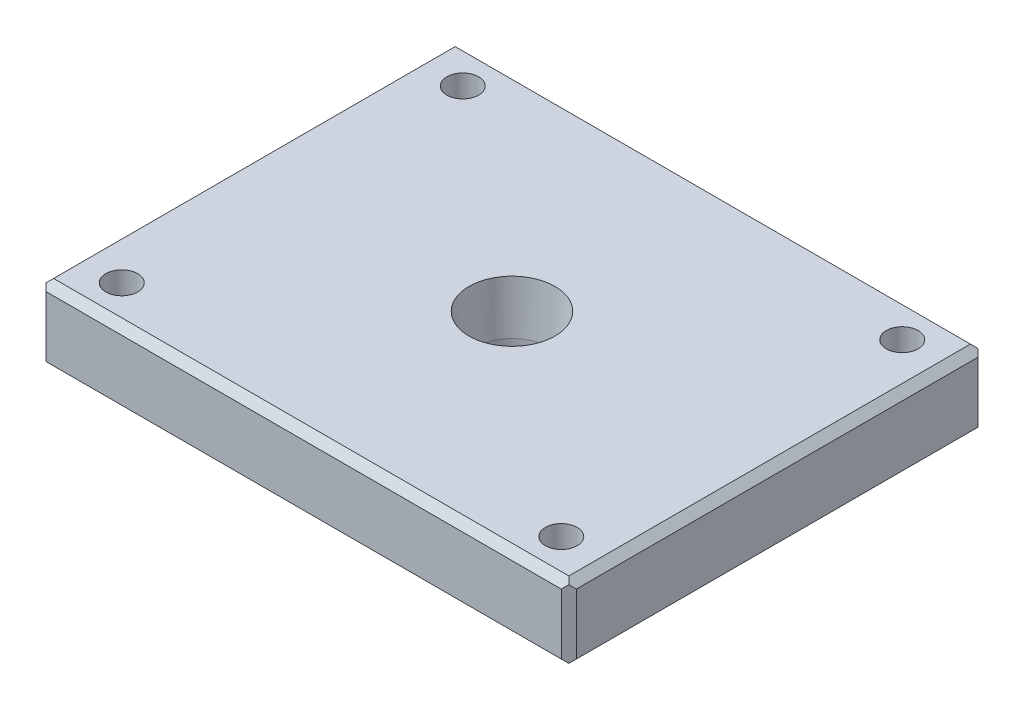
ISO-10303-21;
HEADER;
FILE_DESCRIPTION(('STEP AP214'),'2;1');
FILE_NAME('part.step','',(''),(''),'','','');
FILE_SCHEMA(('AUTOMOTIVE_DESIGN { 1 0 10303 214 1 1 1 1 }'));
ENDSEC;
DATA;
#1=APPLICATION_CONTEXT('core data for automotive mechanical design processes');
#2=APPLICATION_PROTOCOL_DEFINITION('international standard','automotive_design',2000,#1);
#3=PRODUCT_CONTEXT('',#1,'mechanical');
#4=PRODUCT('Part','Part','',(#3));
#5=PRODUCT_RELATED_PRODUCT_CATEGORY('part','',(#4));
#6=PRODUCT_DEFINITION_FORMATION('','',#4);
#7=PRODUCT_DEFINITION_CONTEXT('part definition',#1,'design');
#8=PRODUCT_DEFINITION('design','',#6,#7);
#9=PRODUCT_DEFINITION_SHAPE('','',#8);
#10=(LENGTH_UNIT() NAMED_UNIT(*) SI_UNIT(.MILLI.,.METRE.));
#11=(NAMED_UNIT(*) PLANE_ANGLE_UNIT() SI_UNIT($,.RADIAN.));
#12=(NAMED_UNIT(*) SI_UNIT($,.STERADIAN.) SOLID_ANGLE_UNIT());
#13=UNCERTAINTY_MEASURE_WITH_UNIT(LENGTH_MEASURE(1.E-05),#10,'distance_accuracy_value','');
#14=(GEOMETRIC_REPRESENTATION_CONTEXT(3) GLOBAL_UNCERTAINTY_ASSIGNED_CONTEXT((#13)) GLOBAL_UNIT_ASSIGNED_CONTEXT((#10,
#11,#12)) REPRESENTATION_CONTEXT('',''));
#15=CARTESIAN_POINT('',(0.,0.,0.));
#16=DIRECTION('',(0.,0.,1.));
#17=DIRECTION('',(1.,0.,0.));
#18=AXIS2_PLACEMENT_3D('',#15,#16,#17);
#19=CARTESIAN_POINT('',(0.,-10.,0.));
#20=DIRECTION('',(0.,1.,0.));
#21=DIRECTION('',(0.,0.,1.));
#22=AXIS2_PLACEMENT_3D('',#19,#20,#21);
#23=CYLINDRICAL_SURFACE('',#22,5.2);
#24=CARTESIAN_POINT('',(0.,-10.,0.));
#25=DIRECTION('',(0.,1.,0.));
#26=DIRECTION('',(0.,0.,1.));
#27=AXIS2_PLACEMENT_3D('',#24,#25,#26);
#28=CIRCLE('',#27,5.2);
#29=CARTESIAN_POINT('',(0.,-10.,5.2));
#30=VERTEX_POINT('',#29);
#31=EDGE_CURVE('E262',#30,#30,#28,.T.);
#32=ORIENTED_EDGE('',*,*,#31,.F.);
#33=EDGE_LOOP('',(#32));
#34=FACE_BOUND('',#33,.T.);
#35=CARTESIAN_POINT('',(0.,-6.8,0.));
#36=DIRECTION('',(0.,1.,0.));
#37=DIRECTION('',(0.,0.,-1.));
#38=AXIS2_PLACEMENT_3D('',#35,#36,#37);
#39=CIRCLE('',#38,5.2);
#40=CARTESIAN_POINT('',(0.,-6.8,-5.2));
#41=VERTEX_POINT('',#40);
#42=EDGE_CURVE('E12',#41,#41,#39,.T.);
#43=ORIENTED_EDGE('',*,*,#42,.T.);
#44=EDGE_LOOP('',(#43));
#45=FACE_BOUND('',#44,.T.);
#46=ADVANCED_FACE('F56',(#34,#45),#23,.F.);
#47=CARTESIAN_POINT('',(35.,-10.,27.5));
#48=DIRECTION('',(1.,0.,0.));
#49=DIRECTION('',(0.,0.,-1.));
#50=AXIS2_PLACEMENT_3D('',#47,#48,#49);
#51=PLANE('',#50);
#52=DIRECTION('',(0.,0.,-1.));
#53=VECTOR('',#52,1.);
#54=CARTESIAN_POINT('',(35.,-9.,27.5));
#55=LINE('',#54,#53);
#56=CARTESIAN_POINT('',(35.,-9.,26.5));
#57=VERTEX_POINT('',#56);
#58=CARTESIAN_POINT('',(35.,-9.,-26.5));
#59=VERTEX_POINT('',#58);
#60=EDGE_CURVE('E230',#57,#59,#55,.T.);
#61=ORIENTED_EDGE('',*,*,#60,.T.);
#62=DIRECTION('',(0.,1.,0.));
#63=VECTOR('',#62,1.);
#64=CARTESIAN_POINT('',(35.,-10.,-26.5));
#65=LINE('',#64,#63);
#66=CARTESIAN_POINT('',(35.,-1.00000000000003,-26.5));
#67=VERTEX_POINT('',#66);
#68=EDGE_CURVE('E310',#59,#67,#65,.T.);
#69=ORIENTED_EDGE('',*,*,#68,.T.);
#70=DIRECTION('',(0.,0.,1.));
#71=VECTOR('',#70,1.);
#72=CARTESIAN_POINT('',(35.,-1.00000000000003,27.5));
#73=LINE('',#72,#71);
#74=CARTESIAN_POINT('',(35.,-1.00000000000003,26.5));
#75=VERTEX_POINT('',#74);
#76=EDGE_CURVE('E226',#67,#75,#73,.T.);
#77=ORIENTED_EDGE('',*,*,#76,.T.);
#78=DIRECTION('',(0.,-1.,0.));
#79=VECTOR('',#78,1.);
#80=CARTESIAN_POINT('',(35.,-10.,26.5));
#81=LINE('',#80,#79);
#82=EDGE_CURVE('E307',#75,#57,#81,.T.);
#83=ORIENTED_EDGE('',*,*,#82,.T.);
#84=EDGE_LOOP('',(#61,#69,#77,#83));
#85=FACE_BOUND('',#84,.T.);
#86=ADVANCED_FACE('F367',(#85),#51,.T.);
#87=CARTESIAN_POINT('',(-35.,-10.,27.5));
#88=DIRECTION('',(0.,0.,1.));
#89=DIRECTION('',(1.,0.,0.));
#90=AXIS2_PLACEMENT_3D('',#87,#88,#89);
#91=PLANE('',#90);
#92=DIRECTION('',(1.,0.,0.));
#93=VECTOR('',#92,1.);
#94=CARTESIAN_POINT('',(-35.,-9.,27.5));
#95=LINE('',#94,#93);
#96=CARTESIAN_POINT('',(-34.,-9.,27.5));
#97=VERTEX_POINT('',#96);
#98=CARTESIAN_POINT('',(34.,-9.,27.5));
#99=VERTEX_POINT('',#98);
#100=EDGE_CURVE('E222',#97,#99,#95,.T.);
#101=ORIENTED_EDGE('',*,*,#100,.T.);
#102=DIRECTION('',(0.,1.,0.));
#103=VECTOR('',#102,1.);
#104=CARTESIAN_POINT('',(34.,-10.,27.5));
#105=LINE('',#104,#103);
#106=CARTESIAN_POINT('',(34.,-1.00000000000003,27.5));
#107=VERTEX_POINT('',#106);
#108=EDGE_CURVE('E329',#99,#107,#105,.T.);
#109=ORIENTED_EDGE('',*,*,#108,.T.);
#110=DIRECTION('',(-1.,0.,0.));
#111=VECTOR('',#110,1.);
#112=CARTESIAN_POINT('',(-35.,-1.00000000000003,27.5));
#113=LINE('',#112,#111);
#114=CARTESIAN_POINT('',(-34.,-1.00000000000003,27.5));
#115=VERTEX_POINT('',#114);
#116=EDGE_CURVE('E219',#107,#115,#113,.T.);
#117=ORIENTED_EDGE('',*,*,#116,.T.);
#118=DIRECTION('',(0.,-1.,0.));
#119=VECTOR('',#118,1.);
#120=CARTESIAN_POINT('',(-34.,-10.,27.5));
#121=LINE('',#120,#119);
#122=EDGE_CURVE('E326',#115,#97,#121,.T.);
#123=ORIENTED_EDGE('',*,*,#122,.T.);
#124=EDGE_LOOP('',(#101,#109,#117,#123));
#125=FACE_BOUND('',#124,.T.);
#126=ADVANCED_FACE('F348',(#125),#91,.T.);
#127=CARTESIAN_POINT('',(-35.,-10.,27.5));
#128=DIRECTION('',(-1.,0.,0.));
#129=DIRECTION('',(0.,0.,1.));
#130=AXIS2_PLACEMENT_3D('',#127,#128,#129);
#131=PLANE('',#130);
#132=DIRECTION('',(0.,0.,-1.));
#133=VECTOR('',#132,1.);
#134=CARTESIAN_POINT('',(-35.,-1.00000000000003,-27.5));
#135=LINE('',#134,#133);
#136=CARTESIAN_POINT('',(-35.,-1.00000000000003,26.5));
#137=VERTEX_POINT('',#136);
#138=CARTESIAN_POINT('',(-35.,-1.00000000000003,-26.5));
#139=VERTEX_POINT('',#138);
#140=EDGE_CURVE('E205',#137,#139,#135,.T.);
#141=ORIENTED_EDGE('',*,*,#140,.T.);
#142=DIRECTION('',(0.,-1.,0.));
#143=VECTOR('',#142,1.);
#144=CARTESIAN_POINT('',(-35.,-10.,-26.5));
#145=LINE('',#144,#143);
#146=CARTESIAN_POINT('',(-35.,-9.,-26.5));
#147=VERTEX_POINT('',#146);
#148=EDGE_CURVE('E293',#139,#147,#145,.T.);
#149=ORIENTED_EDGE('',*,*,#148,.T.);
#150=DIRECTION('',(0.,0.,1.));
#151=VECTOR('',#150,1.);
#152=CARTESIAN_POINT('',(-35.,-9.,27.5));
#153=LINE('',#152,#151);
#154=CARTESIAN_POINT('',(-35.,-9.,26.5));
#155=VERTEX_POINT('',#154);
#156=EDGE_CURVE('E211',#147,#155,#153,.T.);
#157=ORIENTED_EDGE('',*,*,#156,.T.);
#158=DIRECTION('',(0.,1.,0.));
#159=VECTOR('',#158,1.);
#160=CARTESIAN_POINT('',(-35.,-10.,26.5));
#161=LINE('',#160,#159);
#162=EDGE_CURVE('E289',#155,#137,#161,.T.);
#163=ORIENTED_EDGE('',*,*,#162,.T.);
#164=EDGE_LOOP('',(#141,#149,#157,#163));
#165=FACE_BOUND('',#164,.T.);
#166=ADVANCED_FACE('F391',(#165),#131,.T.);
#167=CARTESIAN_POINT('',(-35.,-10.,-27.5));
#168=DIRECTION('',(0.,0.,-1.));
#169=DIRECTION('',(-1.,0.,0.));
#170=AXIS2_PLACEMENT_3D('',#167,#168,#169);
#171=PLANE('',#170);
#172=DIRECTION('',(-1.,0.,0.));
#173=VECTOR('',#172,1.);
#174=CARTESIAN_POINT('',(-35.,-9.,-27.5));
#175=LINE('',#174,#173);
#176=CARTESIAN_POINT('',(34.,-9.,-27.5));
#177=VERTEX_POINT('',#176);
#178=CARTESIAN_POINT('',(-34.,-9.,-27.5));
#179=VERTEX_POINT('',#178);
#180=EDGE_CURVE('E199',#177,#179,#175,.T.);
#181=ORIENTED_EDGE('',*,*,#180,.T.);
#182=DIRECTION('',(0.,1.,0.));
#183=VECTOR('',#182,1.);
#184=CARTESIAN_POINT('',(-34.,-10.,-27.5));
#185=LINE('',#184,#183);
#186=CARTESIAN_POINT('',(-34.,-1.00000000000003,-27.5));
#187=VERTEX_POINT('',#186);
#188=EDGE_CURVE('E273',#179,#187,#185,.T.);
#189=ORIENTED_EDGE('',*,*,#188,.T.);
#190=DIRECTION('',(1.,0.,0.));
#191=VECTOR('',#190,1.);
#192=CARTESIAN_POINT('',(35.,-1.00000000000003,-27.5));
#193=LINE('',#192,#191);
#194=CARTESIAN_POINT('',(34.,-1.00000000000003,-27.5));
#195=VERTEX_POINT('',#194);
#196=EDGE_CURVE('E257',#187,#195,#193,.T.);
#197=ORIENTED_EDGE('',*,*,#196,.T.);
#198=DIRECTION('',(0.,-1.,0.));
#199=VECTOR('',#198,1.);
#200=CARTESIAN_POINT('',(34.,-10.,-27.5));
#201=LINE('',#200,#199);
#202=EDGE_CURVE('E248',#195,#177,#201,.T.);
#203=ORIENTED_EDGE('',*,*,#202,.T.);
#204=EDGE_LOOP('',(#181,#189,#197,#203));
#205=FACE_BOUND('',#204,.T.);
#206=ADVANCED_FACE('F385',(#205),#171,.T.);
#207=CARTESIAN_POINT('',(0.,-10.,0.));
#208=DIRECTION('',(0.,-1.,0.));
#209=DIRECTION('',(0.,0.,-1.));
#210=AXIS2_PLACEMENT_3D('',#207,#208,#209);
#211=PLANE('',#210);
#212=CARTESIAN_POINT('',(-29.,-10.,-22.5));
#213=DIRECTION('',(0.,1.,0.));
#214=DIRECTION('',(0.,0.,1.));
#215=AXIS2_PLACEMENT_3D('',#212,#213,#214);
#216=CIRCLE('',#215,2.1);
#217=CARTESIAN_POINT('',(-29.,-10.,-20.4));
#218=VERTEX_POINT('',#217);
#219=EDGE_CURVE('E525',#218,#218,#216,.T.);
#220=ORIENTED_EDGE('',*,*,#219,.T.);
#221=EDGE_LOOP('',(#220));
#222=FACE_BOUND('',#221,.T.);
#223=CARTESIAN_POINT('',(29.,-10.,-22.5));
#224=DIRECTION('',(0.,1.,0.));
#225=DIRECTION('',(0.,0.,1.));
#226=AXIS2_PLACEMENT_3D('',#223,#224,#225);
#227=CIRCLE('',#226,2.1);
#228=CARTESIAN_POINT('',(29.,-10.,-20.4));
#229=VERTEX_POINT('',#228);
#230=EDGE_CURVE('E517',#229,#229,#227,.T.);
#231=ORIENTED_EDGE('',*,*,#230,.T.);
#232=EDGE_LOOP('',(#231));
#233=FACE_BOUND('',#232,.T.);
#234=CARTESIAN_POINT('',(29.,-10.,22.5));
#235=DIRECTION('',(0.,1.,0.));
#236=DIRECTION('',(0.,0.,1.));
#237=AXIS2_PLACEMENT_3D('',#234,#235,#236);
#238=CIRCLE('',#237,2.1);
#239=CARTESIAN_POINT('',(29.,-10.,24.6));
#240=VERTEX_POINT('',#239);
#241=EDGE_CURVE('E509',#240,#240,#238,.T.);
#242=ORIENTED_EDGE('',*,*,#241,.T.);
#243=EDGE_LOOP('',(#242));
#244=FACE_BOUND('',#243,.T.);
#245=CARTESIAN_POINT('',(-29.,-10.,22.5));
#246=DIRECTION('',(0.,1.,0.));
#247=DIRECTION('',(0.,0.,1.));
#248=AXIS2_PLACEMENT_3D('',#245,#246,#247);
#249=CIRCLE('',#248,2.1);
#250=CARTESIAN_POINT('',(-29.,-10.,24.6));
#251=VERTEX_POINT('',#250);
#252=EDGE_CURVE('E501',#251,#251,#249,.T.);
#253=ORIENTED_EDGE('',*,*,#252,.T.);
#254=EDGE_LOOP('',(#253));
#255=FACE_BOUND('',#254,.T.);
#256=ORIENTED_EDGE('',*,*,#31,.T.);
#257=EDGE_LOOP('',(#256));
#258=FACE_BOUND('',#257,.T.);
#259=DIRECTION('',(0.,0.,-1.));
#260=VECTOR('',#259,1.);
#261=CARTESIAN_POINT('',(-34.,-10.,0.));
#262=LINE('',#261,#260);
#263=CARTESIAN_POINT('',(-34.,-10.,26.5));
#264=VERTEX_POINT('',#263);
#265=CARTESIAN_POINT('',(-34.,-10.,-26.5));
#266=VERTEX_POINT('',#265);
#267=EDGE_CURVE('E203',#264,#266,#262,.T.);
#268=ORIENTED_EDGE('',*,*,#267,.T.);
#269=DIRECTION('',(1.,0.,0.));
#270=VECTOR('',#269,1.);
#271=CARTESIAN_POINT('',(0.,-10.,-26.5));
#272=LINE('',#271,#270);
#273=CARTESIAN_POINT('',(34.,-10.,-26.5));
#274=VERTEX_POINT('',#273);
#275=EDGE_CURVE('E179',#266,#274,#272,.T.);
#276=ORIENTED_EDGE('',*,*,#275,.T.);
#277=DIRECTION('',(0.,0.,1.));
#278=VECTOR('',#277,1.);
#279=CARTESIAN_POINT('',(34.,-10.,0.));
#280=LINE('',#279,#278);
#281=CARTESIAN_POINT('',(34.,-10.,26.5));
#282=VERTEX_POINT('',#281);
#283=EDGE_CURVE('E191',#274,#282,#280,.T.);
#284=ORIENTED_EDGE('',*,*,#283,.T.);
#285=DIRECTION('',(-1.,0.,0.));
#286=VECTOR('',#285,1.);
#287=CARTESIAN_POINT('',(0.,-10.,26.5));
#288=LINE('',#287,#286);
#289=EDGE_CURVE('E198',#282,#264,#288,.T.);
#290=ORIENTED_EDGE('',*,*,#289,.T.);
#291=EDGE_LOOP('',(#268,#276,#284,#290));
#292=FACE_BOUND('',#291,.T.);
#293=ADVANCED_FACE('F201',(#222,#233,#244,#255,#258,#292),#211,.T.);
#294=CARTESIAN_POINT('',(0.,0.,0.));
#295=DIRECTION('',(0.,-1.,0.));
#296=DIRECTION('',(0.,0.,-1.));
#297=AXIS2_PLACEMENT_3D('',#294,#295,#296);
#298=PLANE('',#297);
#299=CARTESIAN_POINT('',(-29.,0.,-22.5));
#300=DIRECTION('',(0.,1.,0.));
#301=DIRECTION('',(0.,0.,1.));
#302=AXIS2_PLACEMENT_3D('',#299,#300,#301);
#303=CIRCLE('',#302,2.1);
#304=CARTESIAN_POINT('',(-29.,0.,-20.4));
#305=VERTEX_POINT('',#304);
#306=EDGE_CURVE('E529',#305,#305,#303,.T.);
#307=ORIENTED_EDGE('',*,*,#306,.F.);
#308=EDGE_LOOP('',(#307));
#309=FACE_BOUND('',#308,.T.);
#310=CARTESIAN_POINT('',(29.,0.,-22.5));
#311=DIRECTION('',(0.,1.,0.));
#312=DIRECTION('',(0.,0.,1.));
#313=AXIS2_PLACEMENT_3D('',#310,#311,#312);
#314=CIRCLE('',#313,2.1);
#315=CARTESIAN_POINT('',(29.,0.,-20.4));
#316=VERTEX_POINT('',#315);
#317=EDGE_CURVE('E521',#316,#316,#314,.T.);
#318=ORIENTED_EDGE('',*,*,#317,.F.);
#319=EDGE_LOOP('',(#318));
#320=FACE_BOUND('',#319,.T.);
#321=CARTESIAN_POINT('',(29.,0.,22.5));
#322=DIRECTION('',(0.,1.,0.));
#323=DIRECTION('',(0.,0.,1.));
#324=AXIS2_PLACEMENT_3D('',#321,#322,#323);
#325=CIRCLE('',#324,2.1);
#326=CARTESIAN_POINT('',(29.,0.,24.6));
#327=VERTEX_POINT('',#326);
#328=EDGE_CURVE('E513',#327,#327,#325,.T.);
#329=ORIENTED_EDGE('',*,*,#328,.F.);
#330=EDGE_LOOP('',(#329));
#331=FACE_BOUND('',#330,.T.);
#332=CARTESIAN_POINT('',(-29.,0.,22.5));
#333=DIRECTION('',(0.,1.,0.));
#334=DIRECTION('',(0.,0.,1.));
#335=AXIS2_PLACEMENT_3D('',#332,#333,#334);
#336=CIRCLE('',#335,2.1);
#337=CARTESIAN_POINT('',(-29.,0.,24.6));
#338=VERTEX_POINT('',#337);
#339=EDGE_CURVE('E505',#338,#338,#336,.T.);
#340=ORIENTED_EDGE('',*,*,#339,.F.);
#341=EDGE_LOOP('',(#340));
#342=FACE_BOUND('',#341,.T.);
#343=CARTESIAN_POINT('',(0.,0.,0.));
#344=DIRECTION('',(0.,-1.,0.));
#345=DIRECTION('',(0.,0.,-1.));
#346=AXIS2_PLACEMENT_3D('',#343,#344,#345);
#347=CIRCLE('',#346,5.67550232121587);
#348=CARTESIAN_POINT('',(0.,0.,-5.67550232121587));
#349=VERTEX_POINT('',#348);
#350=EDGE_CURVE('E60',#349,#349,#347,.F.);
#351=ORIENTED_EDGE('',*,*,#350,.F.);
#352=EDGE_LOOP('',(#351));
#353=FACE_BOUND('',#352,.T.);
#354=DIRECTION('',(0.,0.,1.));
#355=VECTOR('',#354,1.);
#356=CARTESIAN_POINT('',(-34.,0.,27.5));
#357=LINE('',#356,#355);
#358=CARTESIAN_POINT('',(-34.,0.,-26.5));
#359=VERTEX_POINT('',#358);
#360=CARTESIAN_POINT('',(-34.,0.,26.5));
#361=VERTEX_POINT('',#360);
#362=EDGE_CURVE('E241',#359,#361,#357,.T.);
#363=ORIENTED_EDGE('',*,*,#362,.T.);
#364=DIRECTION('',(1.,0.,0.));
#365=VECTOR('',#364,1.);
#366=CARTESIAN_POINT('',(35.,0.,26.5));
#367=LINE('',#366,#365);
#368=CARTESIAN_POINT('',(34.,0.,26.5));
#369=VERTEX_POINT('',#368);
#370=EDGE_CURVE('E244',#361,#369,#367,.T.);
#371=ORIENTED_EDGE('',*,*,#370,.T.);
#372=DIRECTION('',(0.,0.,-1.));
#373=VECTOR('',#372,1.);
#374=CARTESIAN_POINT('',(34.,0.,-27.5));
#375=LINE('',#374,#373);
#376=CARTESIAN_POINT('',(34.,0.,-26.5));
#377=VERTEX_POINT('',#376);
#378=EDGE_CURVE('E234',#369,#377,#375,.T.);
#379=ORIENTED_EDGE('',*,*,#378,.T.);
#380=DIRECTION('',(-1.,0.,0.));
#381=VECTOR('',#380,1.);
#382=CARTESIAN_POINT('',(-35.,0.,-26.5));
#383=LINE('',#382,#381);
#384=EDGE_CURVE('E238',#377,#359,#383,.T.);
#385=ORIENTED_EDGE('',*,*,#384,.T.);
#386=EDGE_LOOP('',(#363,#371,#379,#385));
#387=FACE_BOUND('',#386,.T.);
#388=ADVANCED_FACE('F384',(#309,#320,#331,#342,#353,#387),#298,.F.);
#389=CARTESIAN_POINT('',(-35.,-9.,27.5));
#390=DIRECTION('',(0.,0.707106781186547,-0.707106781186547));
#391=DIRECTION('',(1.,0.,0.));
#392=AXIS2_PLACEMENT_3D('',#389,#390,#391);
#393=PLANE('',#392);
#394=DIRECTION('',(-0.577350269189626,-0.577350269189626,-0.577350269189626));
#395=VECTOR('',#394,1.);
#396=CARTESIAN_POINT('',(35.,-9.,27.5));
#397=LINE('',#396,#395);
#398=CARTESIAN_POINT('',(34.5,-9.50000000000001,27.));
#399=VERTEX_POINT('',#398);
#400=EDGE_CURVE('E194',#399,#282,#397,.T.);
#401=ORIENTED_EDGE('',*,*,#400,.F.);
#402=DIRECTION('',(-0.57735026918962,0.577350269189628,0.577350269189628));
#403=VECTOR('',#402,1.);
#404=CARTESIAN_POINT('',(11.0000000000004,13.9999999999999,50.4999999999999));
#405=LINE('',#404,#403);
#406=EDGE_CURVE('E66',#399,#99,#405,.T.);
#407=ORIENTED_EDGE('',*,*,#406,.T.);
#408=ORIENTED_EDGE('',*,*,#100,.F.);
#409=DIRECTION('',(-0.577350269189626,-0.577350269189626,-0.577350269189626));
#410=VECTOR('',#409,1.);
#411=CARTESIAN_POINT('',(-34.3333333333333,-9.33333333333333,27.1666666666667));
#412=LINE('',#411,#410);
#413=CARTESIAN_POINT('',(-34.5,-9.5,27.));
#414=VERTEX_POINT('',#413);
#415=EDGE_CURVE('E336',#97,#414,#412,.T.);
#416=ORIENTED_EDGE('',*,*,#415,.T.);
#417=DIRECTION('',(0.577350269189626,-0.577350269189626,-0.577350269189626));
#418=VECTOR('',#417,1.);
#419=CARTESIAN_POINT('',(-35.,-9.,27.5));
#420=LINE('',#419,#418);
#421=EDGE_CURVE('E187',#264,#414,#420,.F.);
#422=ORIENTED_EDGE('',*,*,#421,.F.);
#423=ORIENTED_EDGE('',*,*,#289,.F.);
#424=EDGE_LOOP('',(#401,#407,#408,#416,#422,#423));
#425=FACE_BOUND('',#424,.T.);
#426=ADVANCED_FACE('F344',(#425),#393,.F.);
#427=CARTESIAN_POINT('',(35.,-9.,27.5));
#428=DIRECTION('',(-0.707106781186547,0.707106781186547,0.));
#429=DIRECTION('',(0.,0.,-1.));
#430=AXIS2_PLACEMENT_3D('',#427,#428,#429);
#431=PLANE('',#430);
#432=DIRECTION('',(0.577350269189626,0.577350269189626,-0.577350269189626));
#433=VECTOR('',#432,1.);
#434=CARTESIAN_POINT('',(16.6666666666667,-27.3333333333333,-9.16666666666667));
#435=LINE('',#434,#433);
#436=CARTESIAN_POINT('',(34.5,-9.50000000000001,-27.));
#437=VERTEX_POINT('',#436);
#438=EDGE_CURVE('E174',#437,#274,#435,.F.);
#439=ORIENTED_EDGE('',*,*,#438,.F.);
#440=DIRECTION('',(0.577350269189626,0.577350269189626,0.577350269189624));
#441=VECTOR('',#440,1.);
#442=CARTESIAN_POINT('',(53.,8.99999999999998,-8.50000000000008));
#443=LINE('',#442,#441);
#444=EDGE_CURVE('E323',#437,#59,#443,.T.);
#445=ORIENTED_EDGE('',*,*,#444,.T.);
#446=ORIENTED_EDGE('',*,*,#60,.F.);
#447=DIRECTION('',(-0.577350269189623,-0.577350269189623,0.577350269189631));
#448=VECTOR('',#447,1.);
#449=CARTESIAN_POINT('',(34.6666666666667,-9.33333333333334,26.8333333333333));
#450=LINE('',#449,#448);
#451=EDGE_CURVE('E320',#57,#399,#450,.T.);
#452=ORIENTED_EDGE('',*,*,#451,.T.);
#453=ORIENTED_EDGE('',*,*,#400,.T.);
#454=ORIENTED_EDGE('',*,*,#283,.F.);
#455=EDGE_LOOP('',(#439,#445,#446,#452,#453,#454));
#456=FACE_BOUND('',#455,.T.);
#457=ADVANCED_FACE('F192',(#456),#431,.F.);
#458=CARTESIAN_POINT('',(-35.,-9.,27.5));
#459=DIRECTION('',(0.707106781186547,0.707106781186547,0.));
#460=DIRECTION('',(0.,0.,1.));
#461=AXIS2_PLACEMENT_3D('',#458,#459,#460);
#462=PLANE('',#461);
#463=ORIENTED_EDGE('',*,*,#156,.F.);
#464=DIRECTION('',(0.577350269189624,-0.577350269189624,-0.57735026918963));
#465=VECTOR('',#464,1.);
#466=CARTESIAN_POINT('',(-53.,9.00000000000006,-8.49999999999974));
#467=LINE('',#466,#465);
#468=CARTESIAN_POINT('',(-34.5,-9.50000000000002,-27.));
#469=VERTEX_POINT('',#468);
#470=EDGE_CURVE('E299',#147,#469,#467,.T.);
#471=ORIENTED_EDGE('',*,*,#470,.T.);
#472=DIRECTION('',(0.577350269189626,-0.577350269189626,0.577350269189626));
#473=VECTOR('',#472,1.);
#474=CARTESIAN_POINT('',(-16.6666666666666,-27.3333333333333,-9.16666666666667));
#475=LINE('',#474,#473);
#476=EDGE_CURVE('E188',#266,#469,#475,.F.);
#477=ORIENTED_EDGE('',*,*,#476,.F.);
#478=ORIENTED_EDGE('',*,*,#267,.F.);
#479=ORIENTED_EDGE('',*,*,#421,.T.);
#480=DIRECTION('',(-0.577350269189626,0.577350269189626,-0.577350269189626));
#481=VECTOR('',#480,1.);
#482=CARTESIAN_POINT('',(-34.6666666666667,-9.33333333333333,26.8333333333333));
#483=LINE('',#482,#481);
#484=EDGE_CURVE('E296',#414,#155,#483,.T.);
#485=ORIENTED_EDGE('',*,*,#484,.T.);
#486=EDGE_LOOP('',(#463,#471,#477,#478,#479,#485));
#487=FACE_BOUND('',#486,.T.);
#488=ADVANCED_FACE('F406',(#487),#462,.F.);
#489=CARTESIAN_POINT('',(-35.,-9.,-27.5));
#490=DIRECTION('',(0.,0.707106781186547,0.707106781186547));
#491=DIRECTION('',(-1.,0.,0.));
#492=AXIS2_PLACEMENT_3D('',#489,#490,#491);
#493=PLANE('',#492);
#494=ORIENTED_EDGE('',*,*,#476,.T.);
#495=DIRECTION('',(0.577350269189622,0.577350269189628,-0.577350269189628));
#496=VECTOR('',#495,1.);
#497=CARTESIAN_POINT('',(-34.3333333333333,-9.33333333333334,-27.1666666666667));
#498=LINE('',#497,#496);
#499=EDGE_CURVE('E304',#469,#179,#498,.T.);
#500=ORIENTED_EDGE('',*,*,#499,.T.);
#501=ORIENTED_EDGE('',*,*,#180,.F.);
#502=DIRECTION('',(0.577350269189627,-0.577350269189625,0.577350269189625));
#503=VECTOR('',#502,1.);
#504=CARTESIAN_POINT('',(10.9999999999999,14.,-50.5));
#505=LINE('',#504,#503);
#506=EDGE_CURVE('E183',#177,#437,#505,.T.);
#507=ORIENTED_EDGE('',*,*,#506,.T.);
#508=ORIENTED_EDGE('',*,*,#438,.T.);
#509=ORIENTED_EDGE('',*,*,#275,.F.);
#510=EDGE_LOOP('',(#494,#500,#501,#507,#508,#509));
#511=FACE_BOUND('',#510,.T.);
#512=ADVANCED_FACE('F177',(#511),#493,.F.);
#513=CARTESIAN_POINT('',(0.,0.,-26.5));
#514=DIRECTION('',(0.,0.707106781186543,-0.707106781186552));
#515=DIRECTION('',(1.,0.,0.));
#516=AXIS2_PLACEMENT_3D('',#513,#514,#515);
#517=PLANE('',#516);
#518=ORIENTED_EDGE('',*,*,#196,.F.);
#519=DIRECTION('',(0.577350269189619,-0.577350269189633,-0.577350269189625));
#520=VECTOR('',#519,1.);
#521=CARTESIAN_POINT('',(-23.3333333333336,-11.6666666666667,-38.1666666666665));
#522=LINE('',#521,#520);
#523=CARTESIAN_POINT('',(-34.5,-0.500000000000007,-27.));
#524=VERTEX_POINT('',#523);
#525=EDGE_CURVE('E280',#187,#524,#522,.F.);
#526=ORIENTED_EDGE('',*,*,#525,.T.);
#527=DIRECTION('',(0.577350269189623,0.577350269189631,0.577350269189623));
#528=VECTOR('',#527,1.);
#529=CARTESIAN_POINT('',(-22.6666666666668,11.3333333333334,-15.1666666666668));
#530=LINE('',#529,#528);
#531=EDGE_CURVE('E250',#359,#524,#530,.F.);
#532=ORIENTED_EDGE('',*,*,#531,.F.);
#533=ORIENTED_EDGE('',*,*,#384,.F.);
#534=DIRECTION('',(-0.577350269189623,0.577350269189631,0.577350269189623));
#535=VECTOR('',#534,1.);
#536=CARTESIAN_POINT('',(25.1666666666668,8.83333333333337,-17.6666666666667));
#537=LINE('',#536,#535);
#538=CARTESIAN_POINT('',(34.5,-0.500000000000013,-27.));
#539=VERTEX_POINT('',#538);
#540=EDGE_CURVE('E265',#539,#377,#537,.T.);
#541=ORIENTED_EDGE('',*,*,#540,.F.);
#542=DIRECTION('',(0.577350269189625,0.577350269189631,0.577350269189623));
#543=VECTOR('',#542,1.);
#544=CARTESIAN_POINT('',(23.3333333333334,-11.6666666666667,-38.1666666666666));
#545=LINE('',#544,#543);
#546=EDGE_CURVE('E277',#539,#195,#545,.F.);
#547=ORIENTED_EDGE('',*,*,#546,.T.);
#548=EDGE_LOOP('',(#518,#526,#532,#533,#541,#547));
#549=FACE_BOUND('',#548,.T.);
#550=ADVANCED_FACE('F405',(#549),#517,.T.);
#551=CARTESIAN_POINT('',(-34.,0.,0.));
#552=DIRECTION('',(-0.707106781186552,0.707106781186543,0.));
#553=DIRECTION('',(0.,0.,-1.));
#554=AXIS2_PLACEMENT_3D('',#551,#552,#553);
#555=PLANE('',#554);
#556=ORIENTED_EDGE('',*,*,#531,.T.);
#557=DIRECTION('',(0.577350269189621,0.577350269189629,-0.577350269189627));
#558=VECTOR('',#557,1.);
#559=CARTESIAN_POINT('',(-43.1666666666666,-9.16666666666674,-18.3333333333333));
#560=LINE('',#559,#558);
#561=EDGE_CURVE('E286',#524,#139,#560,.F.);
#562=ORIENTED_EDGE('',*,*,#561,.T.);
#563=ORIENTED_EDGE('',*,*,#140,.F.);
#564=DIRECTION('',(-0.577350269189623,-0.577350269189631,-0.577350269189623));
#565=VECTOR('',#564,1.);
#566=CARTESIAN_POINT('',(-43.1666666666666,-9.16666666666671,18.3333333333334));
#567=LINE('',#566,#565);
#568=CARTESIAN_POINT('',(-34.5,-0.50000000000002,27.));
#569=VERTEX_POINT('',#568);
#570=EDGE_CURVE('E283',#137,#569,#567,.F.);
#571=ORIENTED_EDGE('',*,*,#570,.T.);
#572=DIRECTION('',(0.577350269189623,0.577350269189631,-0.577350269189623));
#573=VECTOR('',#572,1.);
#574=CARTESIAN_POINT('',(-25.1666666666667,8.83333333333337,17.6666666666667));
#575=LINE('',#574,#573);
#576=EDGE_CURVE('E261',#361,#569,#575,.F.);
#577=ORIENTED_EDGE('',*,*,#576,.F.);
#578=ORIENTED_EDGE('',*,*,#362,.F.);
#579=EDGE_LOOP('',(#556,#562,#563,#571,#577,#578));
#580=FACE_BOUND('',#579,.T.);
#581=ADVANCED_FACE('F436',(#580),#555,.T.);
#582=CARTESIAN_POINT('',(34.,0.,0.));
#583=DIRECTION('',(0.707106781186552,0.707106781186543,0.));
#584=DIRECTION('',(0.,0.,1.));
#585=AXIS2_PLACEMENT_3D('',#582,#583,#584);
#586=PLANE('',#585);
#587=ORIENTED_EDGE('',*,*,#76,.F.);
#588=DIRECTION('',(0.577350269189624,-0.577350269189632,0.577350269189622));
#589=VECTOR('',#588,1.);
#590=CARTESIAN_POINT('',(43.1666666666666,-9.1666666666667,-18.3333333333335));
#591=LINE('',#590,#589);
#592=EDGE_CURVE('E317',#67,#539,#591,.F.);
#593=ORIENTED_EDGE('',*,*,#592,.T.);
#594=ORIENTED_EDGE('',*,*,#540,.T.);
#595=ORIENTED_EDGE('',*,*,#378,.F.);
#596=DIRECTION('',(0.577350269189623,-0.577350269189631,0.577350269189623));
#597=VECTOR('',#596,1.);
#598=CARTESIAN_POINT('',(25.1666666666668,8.83333333333337,17.6666666666667));
#599=LINE('',#598,#597);
#600=CARTESIAN_POINT('',(34.5,-0.500000000000009,27.));
#601=VERTEX_POINT('',#600);
#602=EDGE_CURVE('E258',#601,#369,#599,.F.);
#603=ORIENTED_EDGE('',*,*,#602,.F.);
#604=DIRECTION('',(-0.57735026918962,0.577350269189628,0.577350269189628));
#605=VECTOR('',#604,1.);
#606=CARTESIAN_POINT('',(43.1666666666666,-9.16666666666675,18.3333333333333));
#607=LINE('',#606,#605);
#608=EDGE_CURVE('E314',#601,#75,#607,.F.);
#609=ORIENTED_EDGE('',*,*,#608,.T.);
#610=EDGE_LOOP('',(#587,#593,#594,#595,#603,#609));
#611=FACE_BOUND('',#610,.T.);
#612=ADVANCED_FACE('F430',(#611),#586,.T.);
#613=CARTESIAN_POINT('',(0.,0.,26.5));
#614=DIRECTION('',(0.,0.707106781186543,0.707106781186552));
#615=DIRECTION('',(-1.,0.,0.));
#616=AXIS2_PLACEMENT_3D('',#613,#614,#615);
#617=PLANE('',#616);
#618=ORIENTED_EDGE('',*,*,#116,.F.);
#619=DIRECTION('',(-0.577350269189618,-0.577350269189634,0.577350269189626));
#620=VECTOR('',#619,1.);
#621=CARTESIAN_POINT('',(23.3333333333337,-11.6666666666667,38.1666666666665));
#622=LINE('',#621,#620);
#623=EDGE_CURVE('E81',#107,#601,#622,.F.);
#624=ORIENTED_EDGE('',*,*,#623,.T.);
#625=ORIENTED_EDGE('',*,*,#602,.T.);
#626=ORIENTED_EDGE('',*,*,#370,.F.);
#627=ORIENTED_EDGE('',*,*,#576,.T.);
#628=DIRECTION('',(-0.577350269189623,0.577350269189631,-0.577350269189623));
#629=VECTOR('',#628,1.);
#630=CARTESIAN_POINT('',(-23.3333333333334,-11.6666666666667,38.1666666666665));
#631=LINE('',#630,#629);
#632=EDGE_CURVE('E73',#569,#115,#631,.F.);
#633=ORIENTED_EDGE('',*,*,#632,.T.);
#634=EDGE_LOOP('',(#618,#624,#625,#626,#627,#633));
#635=FACE_BOUND('',#634,.T.);
#636=ADVANCED_FACE('F423',(#635),#617,.T.);
#637=CARTESIAN_POINT('',(0.,-6.8,0.));
#638=DIRECTION('',(0.,1.,0.));
#639=DIRECTION('',(0.,0.,1.));
#640=AXIS2_PLACEMENT_3D('',#637,#638,#639);
#641=CONICAL_SURFACE('',#640,5.2,0.0698131700797733);
#642=ORIENTED_EDGE('',*,*,#42,.F.);
#643=EDGE_LOOP('',(#642));
#644=FACE_BOUND('',#643,.T.);
#645=ORIENTED_EDGE('',*,*,#350,.T.);
#646=EDGE_LOOP('',(#645));
#647=FACE_BOUND('',#646,.T.);
#648=ADVANCED_FACE('F58',(#644,#647),#641,.F.);
#649=CARTESIAN_POINT('',(-34.,-10.,-27.5));
#650=DIRECTION('',(0.707106781186551,0.,0.707106781186544));
#651=DIRECTION('',(0.,1.,0.));
#652=AXIS2_PLACEMENT_3D('',#649,#650,#651);
#653=PLANE('',#652);
#654=ORIENTED_EDGE('',*,*,#470,.F.);
#655=ORIENTED_EDGE('',*,*,#148,.F.);
#656=ORIENTED_EDGE('',*,*,#561,.F.);
#657=ORIENTED_EDGE('',*,*,#525,.F.);
#658=ORIENTED_EDGE('',*,*,#188,.F.);
#659=ORIENTED_EDGE('',*,*,#499,.F.);
#660=EDGE_LOOP('',(#654,#655,#656,#657,#658,#659));
#661=FACE_BOUND('',#660,.T.);
#662=ADVANCED_FACE('F362',(#661),#653,.F.);
#663=CARTESIAN_POINT('',(35.,-10.,-26.5));
#664=DIRECTION('',(-0.707106781186546,0.,0.707106781186549));
#665=DIRECTION('',(0.,1.,0.));
#666=AXIS2_PLACEMENT_3D('',#663,#664,#665);
#667=PLANE('',#666);
#668=ORIENTED_EDGE('',*,*,#506,.F.);
#669=ORIENTED_EDGE('',*,*,#202,.F.);
#670=ORIENTED_EDGE('',*,*,#546,.F.);
#671=ORIENTED_EDGE('',*,*,#592,.F.);
#672=ORIENTED_EDGE('',*,*,#68,.F.);
#673=ORIENTED_EDGE('',*,*,#444,.F.);
#674=EDGE_LOOP('',(#668,#669,#670,#671,#672,#673));
#675=FACE_BOUND('',#674,.T.);
#676=ADVANCED_FACE('F354',(#675),#667,.F.);
#677=CARTESIAN_POINT('',(34.,-10.,27.5));
#678=DIRECTION('',(-0.707106781186552,0.,-0.707106781186543));
#679=DIRECTION('',(0.,1.,0.));
#680=AXIS2_PLACEMENT_3D('',#677,#678,#679);
#681=PLANE('',#680);
#682=ORIENTED_EDGE('',*,*,#451,.F.);
#683=ORIENTED_EDGE('',*,*,#82,.F.);
#684=ORIENTED_EDGE('',*,*,#608,.F.);
#685=ORIENTED_EDGE('',*,*,#623,.F.);
#686=ORIENTED_EDGE('',*,*,#108,.F.);
#687=ORIENTED_EDGE('',*,*,#406,.F.);
#688=EDGE_LOOP('',(#682,#683,#684,#685,#686,#687));
#689=FACE_BOUND('',#688,.T.);
#690=ADVANCED_FACE('F350',(#689),#681,.F.);
#691=CARTESIAN_POINT('',(-35.,-10.,26.5));
#692=DIRECTION('',(0.707106781186547,0.,-0.707106781186547));
#693=DIRECTION('',(0.,1.,0.));
#694=AXIS2_PLACEMENT_3D('',#691,#692,#693);
#695=PLANE('',#694);
#696=ORIENTED_EDGE('',*,*,#415,.F.);
#697=ORIENTED_EDGE('',*,*,#122,.F.);
#698=ORIENTED_EDGE('',*,*,#632,.F.);
#699=ORIENTED_EDGE('',*,*,#570,.F.);
#700=ORIENTED_EDGE('',*,*,#162,.F.);
#701=ORIENTED_EDGE('',*,*,#484,.F.);
#702=EDGE_LOOP('',(#696,#697,#698,#699,#700,#701));
#703=FACE_BOUND('',#702,.T.);
#704=ADVANCED_FACE('F353',(#703),#695,.F.);
#705=CARTESIAN_POINT('',(-29.,0.,22.5));
#706=DIRECTION('',(0.,1.,0.));
#707=DIRECTION('',(0.,0.,1.));
#708=AXIS2_PLACEMENT_3D('',#705,#706,#707);
#709=CYLINDRICAL_SURFACE('',#708,2.1);
#710=ORIENTED_EDGE('',*,*,#252,.F.);
#711=EDGE_LOOP('',(#710));
#712=FACE_BOUND('',#711,.T.);
#713=ORIENTED_EDGE('',*,*,#339,.T.);
#714=EDGE_LOOP('',(#713));
#715=FACE_BOUND('',#714,.T.);
#716=ADVANCED_FACE('F360',(#712,#715),#709,.F.);
#717=CARTESIAN_POINT('',(29.,0.,22.5));
#718=DIRECTION('',(0.,1.,0.));
#719=DIRECTION('',(0.,0.,1.));
#720=AXIS2_PLACEMENT_3D('',#717,#718,#719);
#721=CYLINDRICAL_SURFACE('',#720,2.1);
#722=ORIENTED_EDGE('',*,*,#241,.F.);
#723=EDGE_LOOP('',(#722));
#724=FACE_BOUND('',#723,.T.);
#725=ORIENTED_EDGE('',*,*,#328,.T.);
#726=EDGE_LOOP('',(#725));
#727=FACE_BOUND('',#726,.T.);
#728=ADVANCED_FACE('F569',(#724,#727),#721,.F.);
#729=CARTESIAN_POINT('',(29.,0.,-22.5));
#730=DIRECTION('',(0.,1.,0.));
#731=DIRECTION('',(0.,0.,1.));
#732=AXIS2_PLACEMENT_3D('',#729,#730,#731);
#733=CYLINDRICAL_SURFACE('',#732,2.1);
#734=ORIENTED_EDGE('',*,*,#230,.F.);
#735=EDGE_LOOP('',(#734));
#736=FACE_BOUND('',#735,.T.);
#737=ORIENTED_EDGE('',*,*,#317,.T.);
#738=EDGE_LOOP('',(#737));
#739=FACE_BOUND('',#738,.T.);
#740=ADVANCED_FACE('F574',(#736,#739),#733,.F.);
#741=CARTESIAN_POINT('',(-29.,0.,-22.5));
#742=DIRECTION('',(0.,1.,0.));
#743=DIRECTION('',(0.,0.,1.));
#744=AXIS2_PLACEMENT_3D('',#741,#742,#743);
#745=CYLINDRICAL_SURFACE('',#744,2.1);
#746=ORIENTED_EDGE('',*,*,#219,.F.);
#747=EDGE_LOOP('',(#746));
#748=FACE_BOUND('',#747,.T.);
#749=ORIENTED_EDGE('',*,*,#306,.T.);
#750=EDGE_LOOP('',(#749));
#751=FACE_BOUND('',#750,.T.);
#752=ADVANCED_FACE('F535',(#748,#751),#745,.F.);
#753=CLOSED_SHELL('',(#46,#86,#126,#166,#206,#293,#388,#426,#457,#488,#512,#550,#581,#612,#636,
#648,#662,#676,#690,#704,#716,#728,#740,#752));
#754=MANIFOLD_SOLID_BREP('B2',#753);
#755=ADVANCED_BREP_SHAPE_REPRESENTATION('',(#18,#754),#14);
#756=SHAPE_DEFINITION_REPRESENTATION(#9,#755);
ENDSEC;
END-ISO-10303-21;
